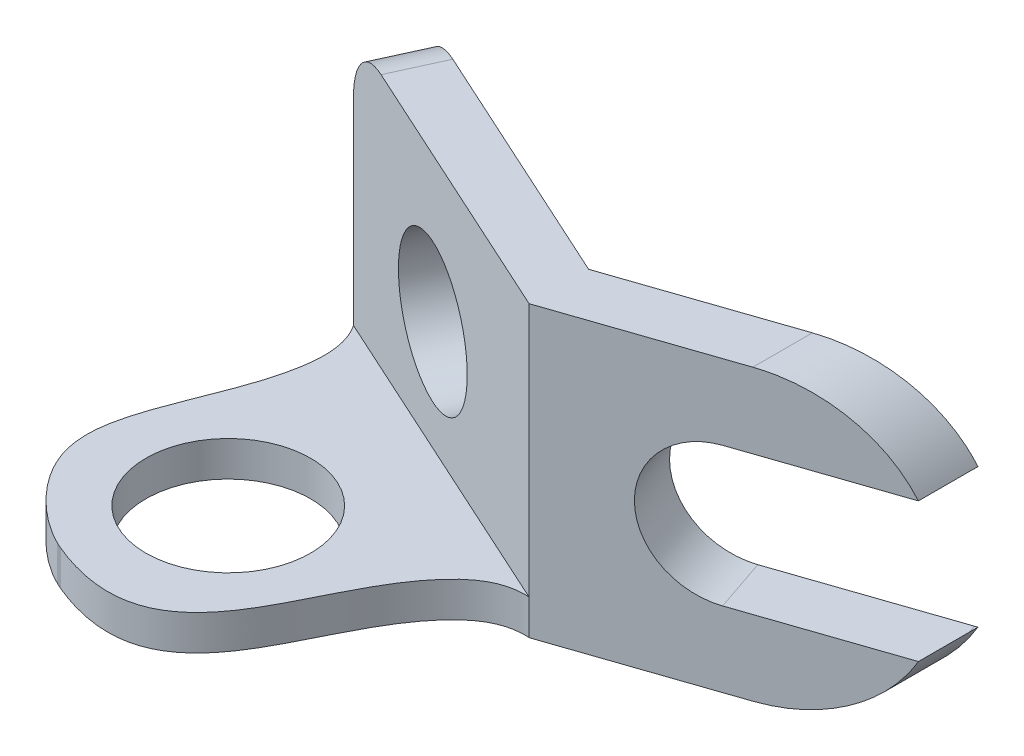
ISO-10303-21;
HEADER;
FILE_DESCRIPTION(('STEP AP214'),'2;1');
FILE_NAME('part.step','',(''),(''),'','','');
FILE_SCHEMA(('AUTOMOTIVE_DESIGN { 1 0 10303 214 1 1 1 1 }'));
ENDSEC;
DATA;
#1=APPLICATION_CONTEXT('core data for automotive mechanical design processes');
#2=APPLICATION_PROTOCOL_DEFINITION('international standard','automotive_design',2000,#1);
#3=PRODUCT_CONTEXT('',#1,'mechanical');
#4=PRODUCT('Part','Part','',(#3));
#5=PRODUCT_RELATED_PRODUCT_CATEGORY('part','',(#4));
#6=PRODUCT_DEFINITION_FORMATION('','',#4);
#7=PRODUCT_DEFINITION_CONTEXT('part definition',#1,'design');
#8=PRODUCT_DEFINITION('design','',#6,#7);
#9=PRODUCT_DEFINITION_SHAPE('','',#8);
#10=(LENGTH_UNIT() NAMED_UNIT(*) SI_UNIT(.MILLI.,.METRE.));
#11=(NAMED_UNIT(*) PLANE_ANGLE_UNIT() SI_UNIT($,.RADIAN.));
#12=(NAMED_UNIT(*) SI_UNIT($,.STERADIAN.) SOLID_ANGLE_UNIT());
#13=UNCERTAINTY_MEASURE_WITH_UNIT(LENGTH_MEASURE(1.E-05),#10,'distance_accuracy_value','');
#14=(GEOMETRIC_REPRESENTATION_CONTEXT(3) GLOBAL_UNCERTAINTY_ASSIGNED_CONTEXT((#13)) GLOBAL_UNIT_ASSIGNED_CONTEXT((#10,
#11,#12)) REPRESENTATION_CONTEXT('',''));
#15=CARTESIAN_POINT('',(0.,0.,0.));
#16=DIRECTION('',(0.,0.,1.));
#17=DIRECTION('',(1.,0.,0.));
#18=AXIS2_PLACEMENT_3D('',#15,#16,#17);
#19=CARTESIAN_POINT('',(-54.0076996514675,-52.,-24.6460646375201));
#20=DIRECTION('',(-0.909749240727173,0.,-0.415158185510453));
#21=DIRECTION('',(-0.415158185510453,0.,0.909749240727173));
#22=AXIS2_PLACEMENT_3D('',#19,#20,#21);
#23=PLANE('',#22);
#24=DIRECTION('',(-0.415158185510453,0.,0.909749240727173));
#25=VECTOR('',#24,1.);
#26=CARTESIAN_POINT('',(-54.0076996514675,-52.,-24.6460646375201));
#27=LINE('',#26,#25);
#28=CARTESIAN_POINT('',(-54.0076996514675,-52.,-24.6460646375201));
#29=VERTEX_POINT('',#28);
#30=CARTESIAN_POINT('',(-58.0489805272499,-52.,-15.7902782490431));
#31=VERTEX_POINT('',#30);
#32=EDGE_CURVE('E206',#29,#31,#27,.T.);
#33=ORIENTED_EDGE('',*,*,#32,.T.);
#34=DIRECTION('',(0.,1.,0.));
#35=VECTOR('',#34,1.);
#36=CARTESIAN_POINT('',(-58.0489805272499,-57.6811942815411,-15.7902782490431));
#37=LINE('',#36,#35);
#38=CARTESIAN_POINT('',(-58.0489805272499,-45.6811942815412,-15.7902782490431));
#39=VERTEX_POINT('',#38);
#40=EDGE_CURVE('E193',#31,#39,#37,.T.);
#41=ORIENTED_EDGE('',*,*,#40,.T.);
#42=DIRECTION('',(0.,1.,0.));
#43=VECTOR('',#42,1.);
#44=CARTESIAN_POINT('',(-58.0489805272499,-52.,-15.7902782490431));
#45=LINE('',#44,#43);
#46=CARTESIAN_POINT('',(-58.0489805272499,-10.,-15.7902782490431));
#47=VERTEX_POINT('',#46);
#48=EDGE_CURVE('E203',#39,#47,#45,.T.);
#49=ORIENTED_EDGE('',*,*,#48,.T.);
#50=DIRECTION('',(-0.415158185510453,0.,0.909749240727173));
#51=VECTOR('',#50,1.);
#52=CARTESIAN_POINT('',(-54.0076996514675,-10.,-24.6460646375201));
#53=LINE('',#52,#51);
#54=CARTESIAN_POINT('',(-54.0076996514675,-10.,-24.6460646375201));
#55=VERTEX_POINT('',#54);
#56=EDGE_CURVE('E102',#47,#55,#53,.F.);
#57=ORIENTED_EDGE('',*,*,#56,.T.);
#58=DIRECTION('',(0.,1.,0.));
#59=VECTOR('',#58,1.);
#60=CARTESIAN_POINT('',(-54.0076996514675,-52.,-24.6460646375201));
#61=LINE('',#60,#59);
#62=EDGE_CURVE('E219',#29,#55,#61,.T.);
#63=ORIENTED_EDGE('',*,*,#62,.F.);
#64=EDGE_LOOP('',(#33,#41,#49,#57,#63));
#65=FACE_BOUND('',#64,.T.);
#66=ADVANCED_FACE('F76',(#65),#23,.T.);
#67=CARTESIAN_POINT('',(0.,-52.,0.));
#68=DIRECTION('',(0.,-1.,0.));
#69=DIRECTION('',(0.,0.,-1.));
#70=AXIS2_PLACEMENT_3D('',#67,#68,#69);
#71=PLANE('',#70);
#72=CARTESIAN_POINT('',(-41.2750839040257,-52.,23.5072544911077));
#73=DIRECTION('',(0.,-1.,0.));
#74=DIRECTION('',(0.,0.,-1.));
#75=AXIS2_PLACEMENT_3D('',#72,#73,#74);
#76=CIRCLE('',#75,14.7969537816018);
#77=CARTESIAN_POINT('',(-41.2750839040257,-52.,38.3042082727095));
#78=VERTEX_POINT('',#77);
#79=EDGE_CURVE('E226',#78,#78,#76,.T.);
#80=ORIENTED_EDGE('',*,*,#79,.F.);
#81=EDGE_LOOP('',(#80));
#82=FACE_BOUND('',#81,.T.);
#83=DIRECTION('',(0.94659390782801,0.,-0.322428245758488));
#84=VECTOR('',#83,1.);
#85=CARTESIAN_POINT('',(0.,-52.,10.6999987938502));
#86=LINE('',#85,#84);
#87=CARTESIAN_POINT('',(0.,-52.,10.6999987938502));
#88=VERTEX_POINT('',#87);
#89=CARTESIAN_POINT('',(30.,-52.,0.48141689430122));
#90=VERTEX_POINT('',#89);
#91=EDGE_CURVE('E387',#88,#90,#86,.T.);
#92=ORIENTED_EDGE('',*,*,#91,.F.);
#93=CARTESIAN_POINT('',(-58.0489805272499,-52.,-15.7902782490431));
#94=CARTESIAN_POINT('',(-55.8314092054151,-52.,-12.4311181699891));
#95=CARTESIAN_POINT('',(-55.4684624616124,-52.,1.4849945707446));
#96=CARTESIAN_POINT('',(-66.2118637888194,-52.,17.9807864890204));
#97=CARTESIAN_POINT('',(-64.1250302515792,-52.,34.3342582513765));
#98=CARTESIAN_POINT('',(-55.0851478318253,-52.,42.9824445178641));
#99=CARTESIAN_POINT('',(-41.7188600248091,-52.,48.512064890667));
#100=CARTESIAN_POINT('',(-33.0055376123488,-52.,48.3707999615034));
#101=CARTESIAN_POINT('',(-20.8558560083952,-52.,36.6853309418611));
#102=CARTESIAN_POINT('',(-16.0806580728267,-52.,18.8636512794607));
#103=CARTESIAN_POINT('',(-4.72783610578573,-52.,10.3811499167112));
#104=CARTESIAN_POINT('',(0.,-52.,10.6999987938502));
#105=B_SPLINE_CURVE_WITH_KNOTS('',3,(#93,#94,#95,#96,#97,#98,#99,#100,#101,#102,#103,#104),
.UNSPECIFIED.,.F.,.F.,(4,1,1,1,1,1,1,1,1,4),(0.,0.0588111550018861,0.209319120283354,
0.241844454477054,0.351539162745189,0.388554906273238,0.5749861462295,0.630925752065176,
0.892011358794326,1.),.UNSPECIFIED.);
#106=CARTESIAN_POINT('',(-49.9070677658037,-52.,45.0838387596838));
#107=VERTEX_POINT('',#106);
#108=EDGE_CURVE('E515',#88,#107,#105,.F.);
#109=ORIENTED_EDGE('',*,*,#108,.T.);
#110=DIRECTION('',(0.909749240727174,0.,0.415158185510452));
#111=VECTOR('',#110,1.);
#112=CARTESIAN_POINT('',(-79.6372061737935,-52.,31.5166822687699));
#113=LINE('',#112,#111);
#114=CARTESIAN_POINT('',(-50.5455116638126,-52.,44.792489013642));
#115=VERTEX_POINT('',#114);
#116=EDGE_CURVE('E225',#115,#107,#113,.T.);
#117=ORIENTED_EDGE('',*,*,#116,.F.);
#118=CARTESIAN_POINT('',(-58.0489805272499,-52.,-15.7902782490431));
#119=CARTESIAN_POINT('',(-55.8314092054151,-52.,-12.4311181699891));
#120=CARTESIAN_POINT('',(-55.4684624616124,-52.,1.4849945707446));
#121=CARTESIAN_POINT('',(-66.2118637888194,-52.,17.9807864890204));
#122=CARTESIAN_POINT('',(-64.1250302515792,-52.,34.3342582513765));
#123=CARTESIAN_POINT('',(-55.0851478318253,-52.,42.9824445178641));
#124=CARTESIAN_POINT('',(-41.7188600248091,-52.,48.512064890667));
#125=CARTESIAN_POINT('',(-33.0055376123488,-52.,48.3707999615034));
#126=CARTESIAN_POINT('',(-20.8558560083952,-52.,36.6853309418611));
#127=CARTESIAN_POINT('',(-16.0806580728267,-52.,18.8636512794607));
#128=CARTESIAN_POINT('',(-4.72783610578573,-52.,10.3811499167112));
#129=CARTESIAN_POINT('',(0.,-52.,10.6999987938502));
#130=B_SPLINE_CURVE_WITH_KNOTS('',3,(#118,#119,#120,#121,#122,#123,#124,#125,#126,#127,#128,
#129),.UNSPECIFIED.,.F.,.F.,(4,1,1,1,1,1,1,1,1,4),(0.,0.0588111550018861,0.209319120283354,
0.241844454477054,0.351539162745189,0.388554906273238,0.5749861462295,0.630925752065176,
0.892011358794326,1.),.UNSPECIFIED.);
#131=EDGE_CURVE('E95',#115,#31,#130,.F.);
#132=ORIENTED_EDGE('',*,*,#131,.T.);
#133=ORIENTED_EDGE('',*,*,#32,.F.);
#134=DIRECTION('',(-0.909749240727174,0.,-0.415158185510453));
#135=VECTOR('',#134,1.);
#136=CARTESIAN_POINT('',(0.,-52.,0.));
#137=LINE('',#136,#135);
#138=CARTESIAN_POINT('',(0.,-52.,0.));
#139=VERTEX_POINT('',#138);
#140=EDGE_CURVE('E410',#139,#29,#137,.T.);
#141=ORIENTED_EDGE('',*,*,#140,.F.);
#142=DIRECTION('',(-0.94659390782801,0.,0.322428245758488));
#143=VECTOR('',#142,1.);
#144=CARTESIAN_POINT('',(0.,-52.,0.));
#145=LINE('',#144,#143);
#146=CARTESIAN_POINT('',(30.,-52.,-10.218581899549));
#147=VERTEX_POINT('',#146);
#148=EDGE_CURVE('E395',#147,#139,#145,.T.);
#149=ORIENTED_EDGE('',*,*,#148,.F.);
#150=DIRECTION('',(0.,0.,-1.));
#151=VECTOR('',#150,1.);
#152=CARTESIAN_POINT('',(30.,-52.,0.));
#153=LINE('',#152,#151);
#154=EDGE_CURVE('E375',#147,#90,#153,.F.);
#155=ORIENTED_EDGE('',*,*,#154,.T.);
#156=EDGE_LOOP('',(#92,#109,#117,#132,#133,#141,#149,#155));
#157=FACE_BOUND('',#156,.T.);
#158=ADVANCED_FACE('F297',(#82,#157),#71,.T.);
#159=CARTESIAN_POINT('',(-79.6372061737935,-45.6811942815412,31.5166822687699));
#160=DIRECTION('',(0.,-1.,0.));
#161=DIRECTION('',(0.,0.,-1.));
#162=AXIS2_PLACEMENT_3D('',#159,#160,#161);
#163=PLANE('',#162);
#164=CARTESIAN_POINT('',(-41.2750839040257,-45.6811942815412,23.5072544911077));
#165=DIRECTION('',(0.,1.,0.));
#166=DIRECTION('',(0.,0.,1.));
#167=AXIS2_PLACEMENT_3D('',#164,#165,#166);
#168=CIRCLE('',#167,14.7969537816018);
#169=CARTESIAN_POINT('',(-41.2750839040257,-45.6811942815412,38.3042082727095));
#170=VERTEX_POINT('',#169);
#171=EDGE_CURVE('E208',#170,#170,#168,.T.);
#172=ORIENTED_EDGE('',*,*,#171,.F.);
#173=EDGE_LOOP('',(#172));
#174=FACE_BOUND('',#173,.T.);
#175=CARTESIAN_POINT('',(-58.0489805272499,-45.6811942815412,-15.7902782490431));
#176=CARTESIAN_POINT('',(-55.8314092054151,-45.6811942815412,-12.4311181699891));
#177=CARTESIAN_POINT('',(-55.4684624616124,-45.6811942815412,1.4849945707446));
#178=CARTESIAN_POINT('',(-66.2118637888194,-45.6811942815412,17.9807864890204));
#179=CARTESIAN_POINT('',(-64.1250302515792,-45.6811942815412,34.3342582513765));
#180=CARTESIAN_POINT('',(-55.0851478318253,-45.6811942815412,42.9824445178641));
#181=CARTESIAN_POINT('',(-41.7188600248091,-45.6811942815412,48.512064890667));
#182=CARTESIAN_POINT('',(-33.0055376123488,-45.6811942815412,48.3707999615034));
#183=CARTESIAN_POINT('',(-20.8558560083952,-45.6811942815412,36.6853309418611));
#184=CARTESIAN_POINT('',(-16.0806580728267,-45.6811942815412,18.8636512794607));
#185=CARTESIAN_POINT('',(-4.72783610578573,-45.6811942815412,10.3811499167112));
#186=CARTESIAN_POINT('',(0.,-45.6811942815412,10.6999987938502));
#187=B_SPLINE_CURVE_WITH_KNOTS('',3,(#175,#176,#177,#178,#179,#180,#181,#182,#183,#184,#185,
#186),.UNSPECIFIED.,.F.,.F.,(4,1,1,1,1,1,1,1,1,4),(0.,0.0588111550018861,0.209319120283354,
0.241844454477054,0.351539162745189,0.388554906273238,0.5749861462295,0.630925752065176,
0.892011358794326,1.),.UNSPECIFIED.);
#188=CARTESIAN_POINT('',(-49.9070677658037,-45.6811942815412,45.0838387596838));
#189=VERTEX_POINT('',#188);
#190=CARTESIAN_POINT('',(0.,-45.6811942815412,10.6999987938502));
#191=VERTEX_POINT('',#190);
#192=EDGE_CURVE('E223',#189,#191,#187,.T.);
#193=ORIENTED_EDGE('',*,*,#192,.T.);
#194=DIRECTION('',(-0.909749240727174,0.,-0.415158185510452));
#195=VECTOR('',#194,1.);
#196=CARTESIAN_POINT('',(-58.0489805272499,-45.6811942815412,-15.7902782490431));
#197=LINE('',#196,#195);
#198=EDGE_CURVE('E213',#191,#39,#197,.T.);
#199=ORIENTED_EDGE('',*,*,#198,.T.);
#200=CARTESIAN_POINT('',(-58.0489805272499,-45.6811942815412,-15.7902782490431));
#201=CARTESIAN_POINT('',(-55.8314092054151,-45.6811942815412,-12.4311181699891));
#202=CARTESIAN_POINT('',(-55.4684624616124,-45.6811942815412,1.4849945707446));
#203=CARTESIAN_POINT('',(-66.2118637888194,-45.6811942815412,17.9807864890204));
#204=CARTESIAN_POINT('',(-64.1250302515792,-45.6811942815412,34.3342582513765));
#205=CARTESIAN_POINT('',(-55.0851478318253,-45.6811942815412,42.9824445178641));
#206=CARTESIAN_POINT('',(-41.7188600248091,-45.6811942815412,48.512064890667));
#207=CARTESIAN_POINT('',(-33.0055376123488,-45.6811942815412,48.3707999615034));
#208=CARTESIAN_POINT('',(-20.8558560083952,-45.6811942815412,36.6853309418611));
#209=CARTESIAN_POINT('',(-16.0806580728267,-45.6811942815412,18.8636512794607));
#210=CARTESIAN_POINT('',(-4.72783610578573,-45.6811942815412,10.3811499167112));
#211=CARTESIAN_POINT('',(0.,-45.6811942815412,10.6999987938502));
#212=B_SPLINE_CURVE_WITH_KNOTS('',3,(#200,#201,#202,#203,#204,#205,#206,#207,#208,#209,#210,
#211),.UNSPECIFIED.,.F.,.F.,(4,1,1,1,1,1,1,1,1,4),(0.,0.0588111550018861,0.209319120283354,
0.241844454477054,0.351539162745189,0.388554906273238,0.5749861462295,0.630925752065176,
0.892011358794326,1.),.UNSPECIFIED.);
#213=CARTESIAN_POINT('',(-50.5455116638253,-45.6811942815412,44.7924890136362));
#214=VERTEX_POINT('',#213);
#215=EDGE_CURVE('E190',#39,#214,#212,.T.);
#216=ORIENTED_EDGE('',*,*,#215,.T.);
#217=DIRECTION('',(-0.909749240727174,0.,-0.415158185510452));
#218=VECTOR('',#217,1.);
#219=CARTESIAN_POINT('',(-79.6372061737935,-45.6811942815412,31.5166822687699));
#220=LINE('',#219,#218);
#221=EDGE_CURVE('E231',#189,#214,#220,.T.);
#222=ORIENTED_EDGE('',*,*,#221,.F.);
#223=EDGE_LOOP('',(#193,#199,#216,#222));
#224=FACE_BOUND('',#223,.T.);
#225=ADVANCED_FACE('F222',(#174,#224),#163,.F.);
#226=CARTESIAN_POINT('',(-25.6295065223259,0.,56.16274690629));
#227=DIRECTION('',(-0.415158185510453,0.,0.909749240727174));
#228=DIRECTION('',(0.909749240727173,0.,0.415158185510452));
#229=AXIS2_PLACEMENT_3D('',#226,#227,#228);
#230=PLANE('',#229);
#231=ORIENTED_EDGE('',*,*,#116,.T.);
#232=DIRECTION('',(0.,1.,0.));
#233=VECTOR('',#232,1.);
#234=CARTESIAN_POINT('',(-49.9070677658037,-57.6811942815411,45.0838387596838));
#235=LINE('',#234,#233);
#236=EDGE_CURVE('E199',#107,#189,#235,.T.);
#237=ORIENTED_EDGE('',*,*,#236,.T.);
#238=ORIENTED_EDGE('',*,*,#221,.T.);
#239=DIRECTION('',(0.,1.,0.));
#240=VECTOR('',#239,1.);
#241=CARTESIAN_POINT('',(-50.5455116638126,-57.6811942815411,44.7924890136422));
#242=LINE('',#241,#240);
#243=EDGE_CURVE('E12',#214,#115,#242,.F.);
#244=ORIENTED_EDGE('',*,*,#243,.T.);
#245=EDGE_LOOP('',(#231,#237,#238,#244));
#246=FACE_BOUND('',#245,.T.);
#247=ADVANCED_FACE('F347',(#246),#230,.T.);
#248=CARTESIAN_POINT('',(-58.0489805272499,-52.,-15.7902782490431));
#249=DIRECTION('',(-0.415158185510453,0.,0.909749240727173));
#250=DIRECTION('',(0.909749240727174,0.,0.415158185510453));
#251=AXIS2_PLACEMENT_3D('',#248,#249,#250);
#252=PLANE('',#251);
#253=CARTESIAN_POINT('',(-31.8412234254511,-26.,-3.83053769901563));
#254=DIRECTION('',(-0.415158185510453,0.,0.909749240727174));
#255=DIRECTION('',(0.909749240727174,0.,0.415158185510453));
#256=AXIS2_PLACEMENT_3D('',#253,#254,#255);
#257=CIRCLE('',#256,12.5);
#258=CARTESIAN_POINT('',(-20.4693579163614,-26.,1.35893961986502));
#259=VERTEX_POINT('',#258);
#260=EDGE_CURVE('E237',#259,#259,#257,.T.);
#261=ORIENTED_EDGE('',*,*,#260,.F.);
#262=EDGE_LOOP('',(#261));
#263=FACE_BOUND('',#262,.T.);
#264=ORIENTED_EDGE('',*,*,#48,.F.);
#265=ORIENTED_EDGE('',*,*,#198,.F.);
#266=DIRECTION('',(0.,1.,0.));
#267=VECTOR('',#266,1.);
#268=CARTESIAN_POINT('',(0.,-52.,10.6999987938502));
#269=LINE('',#268,#267);
#270=CARTESIAN_POINT('',(0.,0.,10.6999987938502));
#271=VERTEX_POINT('',#270);
#272=EDGE_CURVE('E218',#191,#271,#269,.T.);
#273=ORIENTED_EDGE('',*,*,#272,.T.);
#274=DIRECTION('',(0.909749240727173,0.,0.415158185510453));
#275=VECTOR('',#274,1.);
#276=CARTESIAN_POINT('',(-58.0489805272499,0.,-15.7902782490431));
#277=LINE('',#276,#275);
#278=CARTESIAN_POINT('',(-48.9514881199782,0.,-11.6386963939386));
#279=VERTEX_POINT('',#278);
#280=EDGE_CURVE('E396',#279,#271,#277,.T.);
#281=ORIENTED_EDGE('',*,*,#280,.F.);
#282=CARTESIAN_POINT('',(-48.9514881199782,-10.,-11.6386963939386));
#283=DIRECTION('',(-0.415158185510453,0.,0.909749240727173));
#284=DIRECTION('',(0.909749240727174,0.,0.415158185510453));
#285=AXIS2_PLACEMENT_3D('',#282,#283,#284);
#286=CIRCLE('',#285,10.);
#287=EDGE_CURVE('E216',#279,#47,#286,.T.);
#288=ORIENTED_EDGE('',*,*,#287,.T.);
#289=EDGE_LOOP('',(#264,#265,#273,#281,#288));
#290=FACE_BOUND('',#289,.T.);
#291=ADVANCED_FACE('F212',(#263,#290),#252,.T.);
#292=CARTESIAN_POINT('',(0.,-52.,0.));
#293=DIRECTION('',(-0.322428245758488,0.,-0.94659390782801));
#294=DIRECTION('',(-0.94659390782801,0.,0.322428245758488));
#295=AXIS2_PLACEMENT_3D('',#292,#293,#294);
#296=PLANE('',#295);
#297=CARTESIAN_POINT('',(51.7342682074581,-26.,-17.6216952230381));
#298=DIRECTION('',(-0.322428245758488,0.,-0.94659390782801));
#299=DIRECTION('',(-0.94659390782801,0.,0.322428245758488));
#300=AXIS2_PLACEMENT_3D('',#297,#298,#299);
#301=CIRCLE('',#300,12.5);
#302=CARTESIAN_POINT('',(51.7342682074581,-13.5,-17.6216952230381));
#303=VERTEX_POINT('',#302);
#304=CARTESIAN_POINT('',(52.2030545027002,-13.5098141551094,-17.781372928082));
#305=VERTEX_POINT('',#304);
#306=EDGE_CURVE('E269',#303,#305,#301,.T.);
#307=ORIENTED_EDGE('',*,*,#306,.F.);
#308=DIRECTION('',(0.94659390782801,0.,-0.322428245758488));
#309=VECTOR('',#308,1.);
#310=CARTESIAN_POINT('',(0.,-13.5,0.));
#311=LINE('',#310,#309);
#312=CARTESIAN_POINT('',(22.6802522911379,-13.5,-7.72533385131421));
#313=VERTEX_POINT('',#312);
#314=EDGE_CURVE('E258',#313,#303,#311,.T.);
#315=ORIENTED_EDGE('',*,*,#314,.F.);
#316=CARTESIAN_POINT('',(22.6802522911379,-26.,-7.72533385131421));
#317=DIRECTION('',(-0.322428245758488,0.,-0.94659390782801));
#318=DIRECTION('',(-0.94659390782801,0.,0.322428245758488));
#319=AXIS2_PLACEMENT_3D('',#316,#317,#318);
#320=CIRCLE('',#319,12.5);
#321=CARTESIAN_POINT('',(22.6802522911379,-38.5,-7.72533385131421));
#322=VERTEX_POINT('',#321);
#323=EDGE_CURVE('E407',#322,#313,#320,.T.);
#324=ORIENTED_EDGE('',*,*,#323,.F.);
#325=DIRECTION('',(-0.946593907828011,0.,0.322428245758488));
#326=VECTOR('',#325,1.);
#327=CARTESIAN_POINT('',(0.,-38.5,0.));
#328=LINE('',#327,#326);
#329=CARTESIAN_POINT('',(51.7342682074581,-38.5,-17.6216952230381));
#330=VERTEX_POINT('',#329);
#331=EDGE_CURVE('E282',#330,#322,#328,.T.);
#332=ORIENTED_EDGE('',*,*,#331,.F.);
#333=CARTESIAN_POINT('',(52.2030545027002,-38.4901858448906,-17.781372928082));
#334=VERTEX_POINT('',#333);
#335=EDGE_CURVE('E273',#334,#330,#301,.T.);
#336=ORIENTED_EDGE('',*,*,#335,.F.);
#337=CARTESIAN_POINT('',(30.,-27.,-10.218581899549));
#338=DIRECTION('',(-0.322428245758488,0.,-0.94659390782801));
#339=DIRECTION('',(0.94659390782801,0.,-0.322428245758488));
#340=AXIS2_PLACEMENT_3D('',#337,#338,#339);
#341=ELLIPSE('',#340,26.4104805590428,25.);
#342=EDGE_CURVE('E378',#334,#147,#341,.T.);
#343=ORIENTED_EDGE('',*,*,#342,.T.);
#344=ORIENTED_EDGE('',*,*,#148,.T.);
#345=DIRECTION('',(0.,1.,0.));
#346=VECTOR('',#345,1.);
#347=CARTESIAN_POINT('',(0.,-52.,0.));
#348=LINE('',#347,#346);
#349=CARTESIAN_POINT('',(0.,0.,0.));
#350=VERTEX_POINT('',#349);
#351=EDGE_CURVE('E383',#139,#350,#348,.T.);
#352=ORIENTED_EDGE('',*,*,#351,.T.);
#353=DIRECTION('',(-0.94659390782801,0.,0.322428245758488));
#354=VECTOR('',#353,1.);
#355=CARTESIAN_POINT('',(0.,0.,0.));
#356=LINE('',#355,#354);
#357=CARTESIAN_POINT('',(30.,0.,-10.218581899549));
#358=VERTEX_POINT('',#357);
#359=EDGE_CURVE('E404',#358,#350,#356,.T.);
#360=ORIENTED_EDGE('',*,*,#359,.F.);
#361=CARTESIAN_POINT('',(30.,-25.,-10.218581899549));
#362=DIRECTION('',(-0.322428245758488,0.,-0.94659390782801));
#363=DIRECTION('',(-0.94659390782801,0.,0.322428245758488));
#364=AXIS2_PLACEMENT_3D('',#361,#362,#363);
#365=ELLIPSE('',#364,26.4104805590428,25.);
#366=EDGE_CURVE('E354',#358,#305,#365,.T.);
#367=ORIENTED_EDGE('',*,*,#366,.T.);
#368=EDGE_LOOP('',(#307,#315,#324,#332,#336,#343,#344,#352,#360,#367));
#369=FACE_BOUND('',#368,.T.);
#370=ADVANCED_FACE('F339',(#369),#296,.T.);
#371=CARTESIAN_POINT('',(0.,-52.,10.6999987938502));
#372=DIRECTION('',(0.322428245758488,0.,0.94659390782801));
#373=DIRECTION('',(0.94659390782801,0.,-0.322428245758488));
#374=AXIS2_PLACEMENT_3D('',#371,#372,#373);
#375=PLANE('',#374);
#376=DIRECTION('',(0.946593907828011,0.,-0.322428245758488));
#377=VECTOR('',#376,1.);
#378=CARTESIAN_POINT('',(55.,-38.5,-8.0340680219896));
#379=LINE('',#378,#377);
#380=CARTESIAN_POINT('',(25.9459840836799,-38.5,1.86229334973431));
#381=VERTEX_POINT('',#380);
#382=CARTESIAN_POINT('',(52.1979728804231,-38.5,-7.0796432351178));
#383=VERTEX_POINT('',#382);
#384=EDGE_CURVE('E250',#381,#383,#379,.T.);
#385=ORIENTED_EDGE('',*,*,#384,.F.);
#386=CARTESIAN_POINT('',(25.9459840836799,-26.,1.86229334973431));
#387=DIRECTION('',(0.322428245758488,0.,0.946593907828011));
#388=DIRECTION('',(0.946593907828011,0.,-0.322428245758488));
#389=AXIS2_PLACEMENT_3D('',#386,#387,#388);
#390=CIRCLE('',#389,12.5);
#391=CARTESIAN_POINT('',(25.9459840836798,-13.5,1.86229334973431));
#392=VERTEX_POINT('',#391);
#393=EDGE_CURVE('E246',#392,#381,#390,.T.);
#394=ORIENTED_EDGE('',*,*,#393,.F.);
#395=DIRECTION('',(-0.94659390782801,0.,0.322428245758488));
#396=VECTOR('',#395,1.);
#397=CARTESIAN_POINT('',(55.,-13.5,-8.0340680219896));
#398=LINE('',#397,#396);
#399=CARTESIAN_POINT('',(52.1979728804231,-13.5,-7.0796432351178));
#400=VERTEX_POINT('',#399);
#401=EDGE_CURVE('E242',#400,#392,#398,.T.);
#402=ORIENTED_EDGE('',*,*,#401,.F.);
#403=CARTESIAN_POINT('',(30.,-25.,0.48141689430122));
#404=DIRECTION('',(0.322428245758488,0.,0.94659390782801));
#405=DIRECTION('',(-0.94659390782801,0.,0.322428245758488));
#406=AXIS2_PLACEMENT_3D('',#403,#404,#405);
#407=ELLIPSE('',#406,26.4104805590428,25.);
#408=CARTESIAN_POINT('',(30.,0.,0.48141689430122));
#409=VERTEX_POINT('',#408);
#410=EDGE_CURVE('E360',#400,#409,#407,.T.);
#411=ORIENTED_EDGE('',*,*,#410,.T.);
#412=DIRECTION('',(0.94659390782801,0.,-0.322428245758488));
#413=VECTOR('',#412,1.);
#414=CARTESIAN_POINT('',(0.,0.,10.6999987938502));
#415=LINE('',#414,#413);
#416=EDGE_CURVE('E392',#271,#409,#415,.T.);
#417=ORIENTED_EDGE('',*,*,#416,.F.);
#418=ORIENTED_EDGE('',*,*,#272,.F.);
#419=EDGE_CURVE('E80',#88,#191,#269,.T.);
#420=ORIENTED_EDGE('',*,*,#419,.F.);
#421=ORIENTED_EDGE('',*,*,#91,.T.);
#422=CARTESIAN_POINT('',(30.,-27.,0.481416894301215));
#423=DIRECTION('',(0.322428245758488,0.,0.94659390782801));
#424=DIRECTION('',(0.94659390782801,0.,-0.322428245758488));
#425=AXIS2_PLACEMENT_3D('',#422,#423,#424);
#426=ELLIPSE('',#425,26.4104805590428,25.);
#427=EDGE_CURVE('E366',#90,#383,#426,.T.);
#428=ORIENTED_EDGE('',*,*,#427,.T.);
#429=EDGE_LOOP('',(#385,#394,#402,#411,#417,#418,#420,#421,#428));
#430=FACE_BOUND('',#429,.T.);
#431=ADVANCED_FACE('F337',(#430),#375,.T.);
#432=CARTESIAN_POINT('',(0.,-52.,0.));
#433=DIRECTION('',(0.415158185510453,0.,-0.909749240727173));
#434=DIRECTION('',(-0.909749240727173,0.,-0.415158185510453));
#435=AXIS2_PLACEMENT_3D('',#432,#433,#434);
#436=PLANE('',#435);
#437=CARTESIAN_POINT('',(-27.7999425496687,-26.,-12.6863240874926));
#438=DIRECTION('',(0.415158185510453,0.,-0.909749240727173));
#439=DIRECTION('',(-0.909749240727173,0.,-0.415158185510453));
#440=AXIS2_PLACEMENT_3D('',#437,#438,#439);
#441=CIRCLE('',#440,12.5);
#442=CARTESIAN_POINT('',(-39.1718080587584,-26.,-17.8758014063733));
#443=VERTEX_POINT('',#442);
#444=EDGE_CURVE('E241',#443,#443,#441,.T.);
#445=ORIENTED_EDGE('',*,*,#444,.F.);
#446=EDGE_LOOP('',(#445));
#447=FACE_BOUND('',#446,.T.);
#448=ORIENTED_EDGE('',*,*,#62,.T.);
#449=CARTESIAN_POINT('',(-44.9102072441958,-10.,-20.4944827824156));
#450=DIRECTION('',(0.415158185510453,0.,-0.909749240727173));
#451=DIRECTION('',(-0.909749240727173,0.,-0.415158185510453));
#452=AXIS2_PLACEMENT_3D('',#449,#450,#451);
#453=CIRCLE('',#452,10.);
#454=CARTESIAN_POINT('',(-44.9102072441958,0.,-20.4944827824156));
#455=VERTEX_POINT('',#454);
#456=EDGE_CURVE('E87',#55,#455,#453,.T.);
#457=ORIENTED_EDGE('',*,*,#456,.T.);
#458=DIRECTION('',(-0.909749240727174,0.,-0.415158185510453));
#459=VECTOR('',#458,1.);
#460=CARTESIAN_POINT('',(0.,0.,0.));
#461=LINE('',#460,#459);
#462=EDGE_CURVE('E400',#350,#455,#461,.T.);
#463=ORIENTED_EDGE('',*,*,#462,.F.);
#464=ORIENTED_EDGE('',*,*,#351,.F.);
#465=ORIENTED_EDGE('',*,*,#140,.T.);
#466=EDGE_LOOP('',(#448,#457,#463,#464,#465));
#467=FACE_BOUND('',#466,.T.);
#468=ADVANCED_FACE('F335',(#447,#467),#436,.T.);
#469=CARTESIAN_POINT('',(0.,0.,0.));
#470=DIRECTION('',(0.,-1.,0.));
#471=DIRECTION('',(0.,0.,-1.));
#472=AXIS2_PLACEMENT_3D('',#469,#470,#471);
#473=PLANE('',#472);
#474=ORIENTED_EDGE('',*,*,#462,.T.);
#475=DIRECTION('',(-0.415158185510453,0.,0.909749240727173));
#476=VECTOR('',#475,1.);
#477=CARTESIAN_POINT('',(-48.9514881199782,0.,-11.6386963939386));
#478=LINE('',#477,#476);
#479=EDGE_CURVE('E431',#455,#279,#478,.T.);
#480=ORIENTED_EDGE('',*,*,#479,.T.);
#481=ORIENTED_EDGE('',*,*,#280,.T.);
#482=ORIENTED_EDGE('',*,*,#416,.T.);
#483=DIRECTION('',(0.,0.,-1.));
#484=VECTOR('',#483,1.);
#485=CARTESIAN_POINT('',(30.,0.,-18.7340668158398));
#486=LINE('',#485,#484);
#487=EDGE_CURVE('E364',#409,#358,#486,.T.);
#488=ORIENTED_EDGE('',*,*,#487,.T.);
#489=ORIENTED_EDGE('',*,*,#359,.T.);
#490=EDGE_LOOP('',(#474,#480,#481,#482,#488,#489));
#491=FACE_BOUND('',#490,.T.);
#492=ADVANCED_FACE('F323',(#491),#473,.F.);
#493=CARTESIAN_POINT('',(30.,-27.,-18.7340668158398));
#494=DIRECTION('',(0.,0.,-1.));
#495=DIRECTION('',(-1.,0.,0.));
#496=AXIS2_PLACEMENT_3D('',#493,#494,#495);
#497=CYLINDRICAL_SURFACE('',#496,25.);
#498=CARTESIAN_POINT('',(52.1979728804231,-38.5,-16.2603380087298));
#499=CARTESIAN_POINT('',(52.1979729345096,-38.4999996575767,-16.476116865755));
#500=CARTESIAN_POINT('',(52.1982737998383,-38.4994191461801,-16.6918959413414));
#501=CARTESIAN_POINT('',(52.1994923183941,-38.497066753237,-17.1234370280993));
#502=CARTESIAN_POINT('',(52.2004099464882,-38.4952949202364,-17.3391990396079));
#503=CARTESIAN_POINT('',(52.2028771541805,-38.4905288556387,-17.7707061986373));
#504=CARTESIAN_POINT('',(52.2044267341177,-38.4875346233858,-17.986451346149));
#505=CARTESIAN_POINT('',(52.2081735849567,-38.4802892376211,-18.4179236628831));
#506=CARTESIAN_POINT('',(52.2103708822489,-38.4760380328955,-18.6336508310146));
#507=CARTESIAN_POINT('',(52.2128998457539,-38.4711412005304,-18.8493597181007));
#508=B_SPLINE_CURVE_WITH_KNOTS('',3,(#498,#499,#500,#501,#502,#503,#504,#505,#506,#507),
.UNSPECIFIED.,.F.,.F.,(4,2,2,2,4),(0.,0.647335896634864,1.29464541610112,1.94195528283666,
2.58929152707226),.UNSPECIFIED.);
#509=CARTESIAN_POINT('',(52.1979728804231,-38.5,-16.2603380087298));
#510=VERTEX_POINT('',#509);
#511=EDGE_CURVE('E272',#510,#334,#508,.T.);
#512=ORIENTED_EDGE('',*,*,#511,.F.);
#513=DIRECTION('',(0.,0.,-1.));
#514=VECTOR('',#513,1.);
#515=CARTESIAN_POINT('',(52.1979728804231,-38.5,-18.7340668158398));
#516=LINE('',#515,#514);
#517=EDGE_CURVE('E310',#383,#510,#516,.T.);
#518=ORIENTED_EDGE('',*,*,#517,.F.);
#519=ORIENTED_EDGE('',*,*,#427,.F.);
#520=ORIENTED_EDGE('',*,*,#154,.F.);
#521=ORIENTED_EDGE('',*,*,#342,.F.);
#522=EDGE_LOOP('',(#512,#518,#519,#520,#521));
#523=FACE_BOUND('',#522,.T.);
#524=ADVANCED_FACE('F284',(#523),#497,.T.);
#525=CARTESIAN_POINT('',(30.,-25.,0.));
#526=DIRECTION('',(0.,0.,1.));
#527=DIRECTION('',(1.,0.,0.));
#528=AXIS2_PLACEMENT_3D('',#525,#526,#527);
#529=CYLINDRICAL_SURFACE('',#528,25.);
#530=CARTESIAN_POINT('',(52.2128998457539,-13.5288587994696,-18.8493597181007));
#531=CARTESIAN_POINT('',(52.2103708822489,-13.5239619671046,-18.6336508310146));
#532=CARTESIAN_POINT('',(52.2081735849567,-13.5197107623789,-18.4179236628831));
#533=CARTESIAN_POINT('',(52.2044267341177,-13.5124653766142,-17.986451346149));
#534=CARTESIAN_POINT('',(52.2028771541805,-13.5094711443613,-17.7707061986373));
#535=CARTESIAN_POINT('',(52.2004099464882,-13.5047050797636,-17.3391990396079));
#536=CARTESIAN_POINT('',(52.1994923183941,-13.502933246763,-17.1234370280993));
#537=CARTESIAN_POINT('',(52.1982737998383,-13.5005808538199,-16.6918959413414));
#538=CARTESIAN_POINT('',(52.1979729345097,-13.5000003424234,-16.476116865755));
#539=CARTESIAN_POINT('',(52.1979728804231,-13.5,-16.2603380087298));
#540=B_SPLINE_CURVE_WITH_KNOTS('',3,(#530,#531,#532,#533,#534,#535,#536,#537,#538,#539),
.UNSPECIFIED.,.F.,.F.,(4,2,2,2,4),(0.,0.647336244235607,1.29464611097115,1.94195563043741,
2.58929152707228),.UNSPECIFIED.);
#541=CARTESIAN_POINT('',(52.1979728804231,-13.5,-16.2603380087298));
#542=VERTEX_POINT('',#541);
#543=EDGE_CURVE('E301',#305,#542,#540,.T.);
#544=ORIENTED_EDGE('',*,*,#543,.F.);
#545=ORIENTED_EDGE('',*,*,#366,.F.);
#546=ORIENTED_EDGE('',*,*,#487,.F.);
#547=ORIENTED_EDGE('',*,*,#410,.F.);
#548=DIRECTION('',(0.,0.,1.));
#549=VECTOR('',#548,1.);
#550=CARTESIAN_POINT('',(52.1979728804231,-13.5,0.));
#551=LINE('',#550,#549);
#552=EDGE_CURVE('E311',#542,#400,#551,.T.);
#553=ORIENTED_EDGE('',*,*,#552,.F.);
#554=EDGE_LOOP('',(#544,#545,#546,#547,#553));
#555=FACE_BOUND('',#554,.T.);
#556=ADVANCED_FACE('F314',(#555),#529,.T.);
#557=CARTESIAN_POINT('',(38.2337312205586,-26.,-57.2569512290461));
#558=DIRECTION('',(0.322428245758488,0.,0.94659390782801));
#559=DIRECTION('',(0.94659390782801,0.,-0.322428245758488));
#560=AXIS2_PLACEMENT_3D('',#557,#558,#559);
#561=CYLINDRICAL_SURFACE('',#560,12.5);
#562=ORIENTED_EDGE('',*,*,#335,.T.);
#563=DIRECTION('',(0.322428245758488,0.,0.94659390782801));
#564=VECTOR('',#563,1.);
#565=CARTESIAN_POINT('',(38.2337312205586,-38.5,-57.2569512290461));
#566=LINE('',#565,#564);
#567=EDGE_CURVE('E254',#330,#510,#566,.T.);
#568=ORIENTED_EDGE('',*,*,#567,.T.);
#569=ORIENTED_EDGE('',*,*,#511,.T.);
#570=EDGE_LOOP('',(#562,#568,#569));
#571=FACE_BOUND('',#570,.T.);
#572=ADVANCED_FACE('F293',(#571),#561,.F.);
#573=ORIENTED_EDGE('',*,*,#306,.T.);
#574=ORIENTED_EDGE('',*,*,#543,.T.);
#575=DIRECTION('',(0.322428245758488,0.,0.94659390782801));
#576=VECTOR('',#575,1.);
#577=CARTESIAN_POINT('',(38.2337312205586,-13.5,-57.2569512290461));
#578=LINE('',#577,#576);
#579=EDGE_CURVE('E253',#303,#542,#578,.T.);
#580=ORIENTED_EDGE('',*,*,#579,.F.);
#581=EDGE_LOOP('',(#573,#574,#580));
#582=FACE_BOUND('',#581,.T.);
#583=ADVANCED_FACE('F287',(#582),#561,.F.);
#584=CARTESIAN_POINT('',(38.2337312205586,-38.5,-57.2569512290461));
#585=DIRECTION('',(0.,-1.,0.));
#586=DIRECTION('',(0.,0.,-1.));
#587=AXIS2_PLACEMENT_3D('',#584,#585,#586);
#588=PLANE('',#587);
#589=ORIENTED_EDGE('',*,*,#331,.T.);
#590=DIRECTION('',(0.322428245758488,0.,0.94659390782801));
#591=VECTOR('',#590,1.);
#592=CARTESIAN_POINT('',(9.17971530423846,-38.5,-47.3605898573222));
#593=LINE('',#592,#591);
#594=EDGE_CURVE('E259',#322,#381,#593,.T.);
#595=ORIENTED_EDGE('',*,*,#594,.T.);
#596=ORIENTED_EDGE('',*,*,#384,.T.);
#597=ORIENTED_EDGE('',*,*,#517,.T.);
#598=ORIENTED_EDGE('',*,*,#567,.F.);
#599=EDGE_LOOP('',(#589,#595,#596,#597,#598));
#600=FACE_BOUND('',#599,.T.);
#601=ADVANCED_FACE('F292',(#600),#588,.F.);
#602=CARTESIAN_POINT('',(9.17971530423846,-26.,-47.3605898573222));
#603=DIRECTION('',(0.322428245758488,0.,0.94659390782801));
#604=DIRECTION('',(0.94659390782801,0.,-0.322428245758488));
#605=AXIS2_PLACEMENT_3D('',#602,#603,#604);
#606=CYLINDRICAL_SURFACE('',#605,12.5);
#607=ORIENTED_EDGE('',*,*,#323,.T.);
#608=DIRECTION('',(0.322428245758488,0.,0.94659390782801));
#609=VECTOR('',#608,1.);
#610=CARTESIAN_POINT('',(9.17971530423846,-13.5,-47.3605898573222));
#611=LINE('',#610,#609);
#612=EDGE_CURVE('E262',#313,#392,#611,.T.);
#613=ORIENTED_EDGE('',*,*,#612,.T.);
#614=ORIENTED_EDGE('',*,*,#393,.T.);
#615=ORIENTED_EDGE('',*,*,#594,.F.);
#616=EDGE_LOOP('',(#607,#613,#614,#615));
#617=FACE_BOUND('',#616,.T.);
#618=ADVANCED_FACE('F469',(#617),#606,.F.);
#619=CARTESIAN_POINT('',(38.2337312205586,-13.5,-57.2569512290461));
#620=DIRECTION('',(0.,1.,0.));
#621=DIRECTION('',(-1.,0.,0.));
#622=AXIS2_PLACEMENT_3D('',#619,#620,#621);
#623=PLANE('',#622);
#624=ORIENTED_EDGE('',*,*,#314,.T.);
#625=ORIENTED_EDGE('',*,*,#579,.T.);
#626=ORIENTED_EDGE('',*,*,#552,.T.);
#627=ORIENTED_EDGE('',*,*,#401,.T.);
#628=ORIENTED_EDGE('',*,*,#612,.F.);
#629=EDGE_LOOP('',(#624,#625,#626,#627,#628));
#630=FACE_BOUND('',#629,.T.);
#631=ADVANCED_FACE('F295',(#630),#623,.F.);
#632=CARTESIAN_POINT('',(-44.9102072441958,-10.,-20.4944827824156));
#633=DIRECTION('',(0.415158185510453,0.,-0.909749240727173));
#634=DIRECTION('',(-0.909749240727173,0.,-0.415158185510453));
#635=AXIS2_PLACEMENT_3D('',#632,#633,#634);
#636=CYLINDRICAL_SURFACE('',#635,10.);
#637=ORIENTED_EDGE('',*,*,#456,.F.);
#638=ORIENTED_EDGE('',*,*,#56,.F.);
#639=ORIENTED_EDGE('',*,*,#287,.F.);
#640=ORIENTED_EDGE('',*,*,#479,.F.);
#641=EDGE_LOOP('',(#637,#638,#639,#640));
#642=FACE_BOUND('',#641,.T.);
#643=ADVANCED_FACE('F78',(#642),#636,.T.);
#644=CARTESIAN_POINT('',(-10.2529977789075,-26.,-51.1374982168287));
#645=DIRECTION('',(-0.415158185510453,0.,0.909749240727173));
#646=DIRECTION('',(0.909749240727174,0.,0.415158185510453));
#647=AXIS2_PLACEMENT_3D('',#644,#645,#646);
#648=CYLINDRICAL_SURFACE('',#647,12.5);
#649=ORIENTED_EDGE('',*,*,#444,.T.);
#650=EDGE_LOOP('',(#649));
#651=FACE_BOUND('',#650,.T.);
#652=ORIENTED_EDGE('',*,*,#260,.T.);
#653=EDGE_LOOP('',(#652));
#654=FACE_BOUND('',#653,.T.);
#655=ADVANCED_FACE('F461',(#651,#654),#648,.F.);
#656=CARTESIAN_POINT('',(-58.0489805272499,-57.6811942815411,-15.7902782490431));
#657=CARTESIAN_POINT('',(-55.8314092054151,-57.6811942815411,-12.4311181699891));
#658=CARTESIAN_POINT('',(-55.4684624616124,-57.6811942815411,1.4849945707446));
#659=CARTESIAN_POINT('',(-66.2118637888194,-57.6811942815411,17.9807864890204));
#660=CARTESIAN_POINT('',(-64.1250302515792,-57.6811942815411,34.3342582513765));
#661=CARTESIAN_POINT('',(-55.0851478318253,-57.6811942815411,42.9824445178641));
#662=CARTESIAN_POINT('',(-41.7188600248091,-57.6811942815411,48.512064890667));
#663=CARTESIAN_POINT('',(-33.0055376123488,-57.6811942815411,48.3707999615034));
#664=CARTESIAN_POINT('',(-20.8558560083952,-57.6811942815411,36.6853309418611));
#665=CARTESIAN_POINT('',(-16.0806580728267,-57.6811942815411,18.8636512794607));
#666=CARTESIAN_POINT('',(-4.72783610578573,-57.6811942815411,10.3811499167112));
#667=CARTESIAN_POINT('',(0.,-57.6811942815411,10.6999987938502));
#668=B_SPLINE_CURVE_WITH_KNOTS('',3,(#656,#657,#658,#659,#660,#661,#662,#663,#664,#665,#666,
#667),.UNSPECIFIED.,.F.,.F.,(4,1,1,1,1,1,1,1,1,4),(0.,0.0588111550018861,0.209319120283354,
0.241844454477054,0.351539162745189,0.388554906273238,0.5749861462295,0.630925752065176,
0.892011358794326,1.),.UNSPECIFIED.);
#669=DIRECTION('',(0.,1.,0.));
#670=VECTOR('',#669,1.);
#671=SURFACE_OF_LINEAR_EXTRUSION('',#668,#670);
#672=ORIENTED_EDGE('',*,*,#419,.T.);
#673=ORIENTED_EDGE('',*,*,#192,.F.);
#674=ORIENTED_EDGE('',*,*,#236,.F.);
#675=ORIENTED_EDGE('',*,*,#108,.F.);
#676=EDGE_LOOP('',(#672,#673,#674,#675));
#677=FACE_BOUND('',#676,.T.);
#678=ADVANCED_FACE('F466',(#677),#671,.T.);
#679=CARTESIAN_POINT('',(-58.0489805272499,-57.6811942815411,-15.7902782490431));
#680=CARTESIAN_POINT('',(-55.8314092054151,-57.6811942815411,-12.4311181699891));
#681=CARTESIAN_POINT('',(-55.4684624616124,-57.6811942815411,1.4849945707446));
#682=CARTESIAN_POINT('',(-66.2118637888194,-57.6811942815411,17.9807864890204));
#683=CARTESIAN_POINT('',(-64.1250302515792,-57.6811942815411,34.3342582513765));
#684=CARTESIAN_POINT('',(-55.0851478318253,-57.6811942815411,42.9824445178641));
#685=CARTESIAN_POINT('',(-41.7188600248091,-57.6811942815411,48.512064890667));
#686=CARTESIAN_POINT('',(-33.0055376123488,-57.6811942815411,48.3707999615034));
#687=CARTESIAN_POINT('',(-20.8558560083952,-57.6811942815411,36.6853309418611));
#688=CARTESIAN_POINT('',(-16.0806580728267,-57.6811942815411,18.8636512794607));
#689=CARTESIAN_POINT('',(-4.72783610578573,-57.6811942815411,10.3811499167112));
#690=CARTESIAN_POINT('',(0.,-57.6811942815411,10.6999987938502));
#691=B_SPLINE_CURVE_WITH_KNOTS('',3,(#679,#680,#681,#682,#683,#684,#685,#686,#687,#688,#689,
#690),.UNSPECIFIED.,.F.,.F.,(4,1,1,1,1,1,1,1,1,4),(0.,0.0588111550018861,0.209319120283354,
0.241844454477054,0.351539162745189,0.388554906273238,0.5749861462295,0.630925752065176,
0.892011358794326,1.),.UNSPECIFIED.);
#692=DIRECTION('',(0.,1.,0.));
#693=VECTOR('',#692,1.);
#694=SURFACE_OF_LINEAR_EXTRUSION('',#691,#693);
#695=ORIENTED_EDGE('',*,*,#243,.F.);
#696=ORIENTED_EDGE('',*,*,#215,.F.);
#697=ORIENTED_EDGE('',*,*,#40,.F.);
#698=ORIENTED_EDGE('',*,*,#131,.F.);
#699=EDGE_LOOP('',(#695,#696,#697,#698));
#700=FACE_BOUND('',#699,.T.);
#701=ADVANCED_FACE('F192',(#700),#694,.T.);
#702=CARTESIAN_POINT('',(-41.2750839040257,-57.6811942815411,23.5072544911077));
#703=DIRECTION('',(0.,1.,0.));
#704=DIRECTION('',(0.,0.,1.));
#705=AXIS2_PLACEMENT_3D('',#702,#703,#704);
#706=CYLINDRICAL_SURFACE('',#705,14.7969537816018);
#707=CARTESIAN_POINT('',(-41.2750839040257,-52.,38.3042082727095));
#708=CARTESIAN_POINT('',(-41.2750839040257,-51.9341791070994,38.3042082727095));
#709=CARTESIAN_POINT('',(-41.2750839040257,-51.8683582141988,38.3042082727095));
#710=CARTESIAN_POINT('',(-41.2750839040257,-51.7367164283975,38.3042082727095));
#711=CARTESIAN_POINT('',(-41.2750839040257,-51.6708955354969,38.3042082727095));
#712=CARTESIAN_POINT('',(-41.2750839040257,-51.5392537496957,38.3042082727095));
#713=CARTESIAN_POINT('',(-41.2750839040257,-51.4734328567951,38.3042082727095));
#714=CARTESIAN_POINT('',(-41.2750839040257,-51.3417910709939,38.3042082727095));
#715=CARTESIAN_POINT('',(-41.2750839040257,-51.2759701780933,38.3042082727095));
#716=CARTESIAN_POINT('',(-41.2750839040257,-51.144328392292,38.3042082727095));
#717=CARTESIAN_POINT('',(-41.2750839040257,-51.0785074993914,38.3042082727095));
#718=CARTESIAN_POINT('',(-41.2750839040257,-50.9468657135902,38.3042082727095));
#719=CARTESIAN_POINT('',(-41.2750839040257,-50.8810448206896,38.3042082727095));
#720=CARTESIAN_POINT('',(-41.2750839040257,-50.7494030348883,38.3042082727095));
#721=CARTESIAN_POINT('',(-41.2750839040257,-50.6835821419877,38.3042082727095));
#722=CARTESIAN_POINT('',(-41.2750839040257,-50.5519403561865,38.3042082727095));
#723=CARTESIAN_POINT('',(-41.2750839040257,-50.4861194632859,38.3042082727095));
#724=CARTESIAN_POINT('',(-41.2750839040257,-50.3544776774847,38.3042082727095));
#725=CARTESIAN_POINT('',(-41.2750839040257,-50.2886567845841,38.3042082727095));
#726=CARTESIAN_POINT('',(-41.2750839040257,-50.1570149987828,38.3042082727095));
#727=CARTESIAN_POINT('',(-41.2750839040257,-50.0911941058822,38.3042082727095));
#728=CARTESIAN_POINT('',(-41.2750839040257,-49.959552320081,38.3042082727095));
#729=CARTESIAN_POINT('',(-41.2750839040257,-49.8937314271804,38.3042082727095));
#730=CARTESIAN_POINT('',(-41.2750839040257,-49.7620896413792,38.3042082727095));
#731=CARTESIAN_POINT('',(-41.2750839040257,-49.6962687484785,38.3042082727095));
#732=CARTESIAN_POINT('',(-41.2750839040257,-49.5646269626773,38.3042082727095));
#733=CARTESIAN_POINT('',(-41.2750839040257,-49.4988060697767,38.3042082727095));
#734=CARTESIAN_POINT('',(-41.2750839040257,-49.3671642839755,38.3042082727095));
#735=CARTESIAN_POINT('',(-41.2750839040257,-49.3013433910749,38.3042082727095));
#736=CARTESIAN_POINT('',(-41.2750839040257,-49.1697016052736,38.3042082727095));
#737=CARTESIAN_POINT('',(-41.2750839040257,-49.103880712373,38.3042082727095));
#738=CARTESIAN_POINT('',(-41.2750839040257,-48.9722389265718,38.3042082727095));
#739=CARTESIAN_POINT('',(-41.2750839040257,-48.9064180336712,38.3042082727095));
#740=CARTESIAN_POINT('',(-41.2750839040257,-48.77477624787,38.3042082727095));
#741=CARTESIAN_POINT('',(-41.2750839040257,-48.7089553549693,38.3042082727095));
#742=CARTESIAN_POINT('',(-41.2750839040257,-48.5773135691681,38.3042082727095));
#743=CARTESIAN_POINT('',(-41.2750839040257,-48.5114926762675,38.3042082727095));
#744=CARTESIAN_POINT('',(-41.2750839040257,-48.3798508904663,38.3042082727095));
#745=CARTESIAN_POINT('',(-41.2750839040257,-48.3140299975657,38.3042082727095));
#746=CARTESIAN_POINT('',(-41.2750839040257,-48.1823882117644,38.3042082727095));
#747=CARTESIAN_POINT('',(-41.2750839040257,-48.1165673188638,38.3042082727095));
#748=CARTESIAN_POINT('',(-41.2750839040257,-47.9849255330626,38.3042082727095));
#749=CARTESIAN_POINT('',(-41.2750839040257,-47.919104640162,38.3042082727095));
#750=CARTESIAN_POINT('',(-41.2750839040257,-47.7874628543608,38.3042082727095));
#751=CARTESIAN_POINT('',(-41.2750839040257,-47.7216419614602,38.3042082727095));
#752=CARTESIAN_POINT('',(-41.2750839040257,-47.5900001756589,38.3042082727095));
#753=CARTESIAN_POINT('',(-41.2750839040257,-47.5241792827583,38.3042082727095));
#754=CARTESIAN_POINT('',(-41.2750839040257,-47.3925374969571,38.3042082727095));
#755=CARTESIAN_POINT('',(-41.2750839040257,-47.3267166040565,38.3042082727095));
#756=CARTESIAN_POINT('',(-41.2750839040257,-47.1950748182553,38.3042082727095));
#757=CARTESIAN_POINT('',(-41.2750839040257,-47.1292539253546,38.3042082727095));
#758=CARTESIAN_POINT('',(-41.2750839040257,-46.9976121395534,38.3042082727095));
#759=CARTESIAN_POINT('',(-41.2750839040257,-46.9317912466528,38.3042082727095));
#760=CARTESIAN_POINT('',(-41.2750839040257,-46.8001494608516,38.3042082727095));
#761=CARTESIAN_POINT('',(-41.2750839040257,-46.734328567951,38.3042082727095));
#762=CARTESIAN_POINT('',(-41.2750839040257,-46.6026867821497,38.3042082727095));
#763=CARTESIAN_POINT('',(-41.2750839040257,-46.5368658892491,38.3042082727095));
#764=CARTESIAN_POINT('',(-41.2750839040257,-46.4052241034479,38.3042082727095));
#765=CARTESIAN_POINT('',(-41.2750839040257,-46.3394032105473,38.3042082727095));
#766=CARTESIAN_POINT('',(-41.2750839040257,-46.2077614247461,38.3042082727095));
#767=CARTESIAN_POINT('',(-41.2750839040257,-46.1419405318454,38.3042082727095));
#768=CARTESIAN_POINT('',(-41.2750839040257,-46.0102987460442,38.3042082727095));
#769=CARTESIAN_POINT('',(-41.2750839040257,-45.9444778531436,38.3042082727095));
#770=CARTESIAN_POINT('',(-41.2750839040257,-45.8128360673424,38.3042082727095));
#771=CARTESIAN_POINT('',(-41.2750839040257,-45.7470151744418,38.3042082727095));
#772=CARTESIAN_POINT('',(-41.2750839040257,-45.6811942815412,38.3042082727095));
#773=B_SPLINE_CURVE_WITH_KNOTS('',3,(#707,#708,#709,#710,#711,#712,#713,#714,#715,#716,#717,
#718,#719,#720,#721,#722,#723,#724,#725,#726,#727,#728,#729,#730,#731,#732,#733,#734,#735,#736,
#737,#738,#739,#740,#741,#742,#743,#744,#745,#746,#747,#748,#749,#750,#751,#752,#753,#754,#755,
#756,#757,#758,#759,#760,#761,#762,#763,#764,#765,#766,#767,#768,#769,#770,#771,#772),
.UNSPECIFIED.,.F.,.F.,(4,2,2,2,2,2,2,2,2,2,2,2,2,2,2,2,2,2,2,2,2,2,2,2,2,2,2,2,2,2,2,2,4),(0.,
0.19746267870184,0.39492535740368,0.592388036105521,0.789850714807361,0.987313393509194,
1.18477607221103,1.38223875091287,1.57970142961471,1.77716410831655,1.97462678701839,
2.17208946572023,2.36955214442207,2.56701482312391,2.76447750182574,2.96194018052758,
3.15940285922942,3.35686553793126,3.5543282166331,3.75179089533494,3.94925357403678,
4.14671625273862,4.34417893144046,4.5416416101423,4.73910428884413,4.93656696754597,
5.13402964624781,5.33149232494965,5.52895500365149,5.72641768235332,5.92388036105516,
6.121343039757,6.31880571845884),.UNSPECIFIED.);
#774=EDGE_CURVE('BSEAM486',#78,#170,#773,.T.);
#775=ORIENTED_EDGE('',*,*,#79,.T.);
#776=ORIENTED_EDGE('',*,*,#171,.T.);
#777=ORIENTED_EDGE('',*,*,#774,.T.);
#778=ORIENTED_EDGE('',*,*,#774,.F.);
#779=EDGE_LOOP('',(#775,#777,#776,#778));
#780=FACE_BOUND('',#779,.T.);
#781=ADVANCED_FACE('F486',(#780),#706,.F.);
#782=CLOSED_SHELL('',(#66,#158,#225,#247,#291,#370,#431,#468,#492,#524,#556,#572,#583,#601,#618,
#631,#643,#655,#678,#701,#781));
#783=MANIFOLD_SOLID_BREP('B2',#782);
#784=ADVANCED_BREP_SHAPE_REPRESENTATION('',(#18,#783),#14);
#785=SHAPE_DEFINITION_REPRESENTATION(#9,#784);
ENDSEC;
END-ISO-10303-21;
